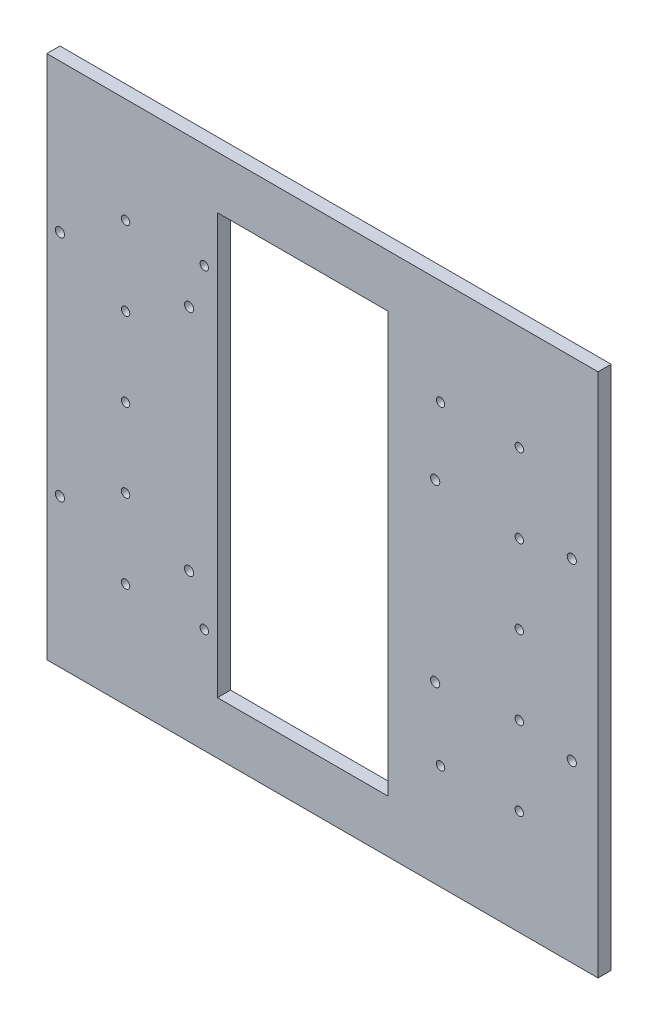
ISO-10303-21;
HEADER;
FILE_DESCRIPTION(('STEP AP214'),'2;1');
FILE_NAME('part.step','',(''),(''),'','','');
FILE_SCHEMA(('AUTOMOTIVE_DESIGN { 1 0 10303 214 1 1 1 1 }'));
ENDSEC;
DATA;
#1=APPLICATION_CONTEXT('core data for automotive mechanical design processes');
#2=APPLICATION_PROTOCOL_DEFINITION('international standard','automotive_design',2000,#1);
#3=PRODUCT_CONTEXT('',#1,'mechanical');
#4=PRODUCT('Part','Part','',(#3));
#5=PRODUCT_RELATED_PRODUCT_CATEGORY('part','',(#4));
#6=PRODUCT_DEFINITION_FORMATION('','',#4);
#7=PRODUCT_DEFINITION_CONTEXT('part definition',#1,'design');
#8=PRODUCT_DEFINITION('design','',#6,#7);
#9=PRODUCT_DEFINITION_SHAPE('','',#8);
#10=(LENGTH_UNIT() NAMED_UNIT(*) SI_UNIT(.MILLI.,.METRE.));
#11=(NAMED_UNIT(*) PLANE_ANGLE_UNIT() SI_UNIT($,.RADIAN.));
#12=(NAMED_UNIT(*) SI_UNIT($,.STERADIAN.) SOLID_ANGLE_UNIT());
#13=UNCERTAINTY_MEASURE_WITH_UNIT(LENGTH_MEASURE(1.E-05),#10,'distance_accuracy_value','');
#14=(GEOMETRIC_REPRESENTATION_CONTEXT(3) GLOBAL_UNCERTAINTY_ASSIGNED_CONTEXT((#13)) GLOBAL_UNIT_ASSIGNED_CONTEXT((#10,
#11,#12)) REPRESENTATION_CONTEXT('',''));
#15=CARTESIAN_POINT('',(0.,0.,0.));
#16=DIRECTION('',(0.,0.,1.));
#17=DIRECTION('',(1.,0.,0.));
#18=AXIS2_PLACEMENT_3D('',#15,#16,#17);
#19=CARTESIAN_POINT('',(0.,0.,5.));
#20=DIRECTION('',(0.,0.,1.));
#21=DIRECTION('',(1.,0.,0.));
#22=AXIS2_PLACEMENT_3D('',#19,#20,#21);
#23=PLANE('',#22);
#24=CARTESIAN_POINT('',(95.050009971844,33.7791498434514,5.));
#25=DIRECTION('',(0.,0.,1.));
#26=DIRECTION('',(1.,0.,0.));
#27=AXIS2_PLACEMENT_3D('',#24,#25,#26);
#28=CIRCLE('',#27,1.75);
#29=CARTESIAN_POINT('',(96.800009971844,33.7791498434514,5.));
#30=VERTEX_POINT('',#29);
#31=EDGE_CURVE('E855',#30,#30,#28,.T.);
#32=ORIENTED_EDGE('',*,*,#31,.F.);
#33=EDGE_LOOP('',(#32));
#34=FACE_BOUND('',#33,.T.);
#35=CARTESIAN_POINT('',(95.050009971844,-32.9208501565486,5.));
#36=DIRECTION('',(0.,0.,1.));
#37=DIRECTION('',(1.,0.,0.));
#38=AXIS2_PLACEMENT_3D('',#35,#36,#37);
#39=CIRCLE('',#38,1.75);
#40=CARTESIAN_POINT('',(96.800009971844,-32.9208501565486,5.));
#41=VERTEX_POINT('',#40);
#42=EDGE_CURVE('E851',#41,#41,#39,.T.);
#43=ORIENTED_EDGE('',*,*,#42,.F.);
#44=EDGE_LOOP('',(#43));
#45=FACE_BOUND('',#44,.T.);
#46=CARTESIAN_POINT('',(43.000009971844,-32.9208501565486,5.));
#47=DIRECTION('',(0.,0.,1.));
#48=DIRECTION('',(1.,0.,0.));
#49=AXIS2_PLACEMENT_3D('',#46,#47,#48);
#50=CIRCLE('',#49,1.75);
#51=CARTESIAN_POINT('',(44.750009971844,-32.9208501565486,5.));
#52=VERTEX_POINT('',#51);
#53=EDGE_CURVE('E848',#52,#52,#50,.T.);
#54=ORIENTED_EDGE('',*,*,#53,.F.);
#55=EDGE_LOOP('',(#54));
#56=FACE_BOUND('',#55,.T.);
#57=CARTESIAN_POINT('',(43.000009971844,33.7791498434514,5.));
#58=DIRECTION('',(0.,0.,1.));
#59=DIRECTION('',(1.,0.,0.));
#60=AXIS2_PLACEMENT_3D('',#57,#58,#59);
#61=CIRCLE('',#60,1.75);
#62=CARTESIAN_POINT('',(44.750009971844,33.7791498434514,5.));
#63=VERTEX_POINT('',#62);
#64=EDGE_CURVE('E144',#63,#63,#61,.T.);
#65=ORIENTED_EDGE('',*,*,#64,.F.);
#66=EDGE_LOOP('',(#65));
#67=FACE_BOUND('',#66,.T.);
#68=CARTESIAN_POINT('',(-50.739990028156,43.9691498434514,5.));
#69=DIRECTION('',(0.,0.,1.));
#70=DIRECTION('',(1.,0.,0.));
#71=AXIS2_PLACEMENT_3D('',#68,#69,#70);
#72=CIRCLE('',#71,1.75);
#73=CARTESIAN_POINT('',(-48.989990028156,43.9691498434514,5.));
#74=VERTEX_POINT('',#73);
#75=EDGE_CURVE('E151',#74,#74,#72,.T.);
#76=ORIENTED_EDGE('',*,*,#75,.F.);
#77=EDGE_LOOP('',(#76));
#78=FACE_BOUND('',#77,.T.);
#79=CARTESIAN_POINT('',(-50.739990028156,-43.1108501565486,5.));
#80=DIRECTION('',(0.,0.,1.));
#81=DIRECTION('',(1.,0.,0.));
#82=AXIS2_PLACEMENT_3D('',#79,#80,#81);
#83=CIRCLE('',#82,1.75);
#84=CARTESIAN_POINT('',(-48.989990028156,-43.1108501565486,5.));
#85=VERTEX_POINT('',#84);
#86=EDGE_CURVE('E157',#85,#85,#83,.T.);
#87=ORIENTED_EDGE('',*,*,#86,.F.);
#88=EDGE_LOOP('',(#87));
#89=FACE_BOUND('',#88,.T.);
#90=CARTESIAN_POINT('',(-99.949990028156,-43.1108501565486,5.));
#91=DIRECTION('',(0.,0.,1.));
#92=DIRECTION('',(1.,0.,0.));
#93=AXIS2_PLACEMENT_3D('',#90,#91,#92);
#94=CIRCLE('',#93,1.75);
#95=CARTESIAN_POINT('',(-98.199990028156,-43.1108501565486,5.));
#96=VERTEX_POINT('',#95);
#97=EDGE_CURVE('E152',#96,#96,#94,.T.);
#98=ORIENTED_EDGE('',*,*,#97,.F.);
#99=EDGE_LOOP('',(#98));
#100=FACE_BOUND('',#99,.T.);
#101=CARTESIAN_POINT('',(-99.949990028156,43.9691498434514,5.));
#102=DIRECTION('',(0.,0.,1.));
#103=DIRECTION('',(1.,0.,0.));
#104=AXIS2_PLACEMENT_3D('',#101,#102,#103);
#105=CIRCLE('',#104,1.75);
#106=CARTESIAN_POINT('',(-98.199990028156,43.9691498434514,5.));
#107=VERTEX_POINT('',#106);
#108=EDGE_CURVE('E156',#107,#107,#105,.T.);
#109=ORIENTED_EDGE('',*,*,#108,.F.);
#110=EDGE_LOOP('',(#109));
#111=FACE_BOUND('',#110,.T.);
#112=CARTESIAN_POINT('',(45.050009971844,60.4291498434514,5.));
#113=DIRECTION('',(0.,0.,1.));
#114=DIRECTION('',(1.,0.,0.));
#115=AXIS2_PLACEMENT_3D('',#112,#113,#114);
#116=CIRCLE('',#115,1.59999999999999);
#117=CARTESIAN_POINT('',(46.650009971844,60.4291498434514,5.));
#118=VERTEX_POINT('',#117);
#119=EDGE_CURVE('E191',#118,#118,#116,.T.);
#120=ORIENTED_EDGE('',*,*,#119,.F.);
#121=EDGE_LOOP('',(#120));
#122=FACE_BOUND('',#121,.T.);
#123=CARTESIAN_POINT('',(75.050009971844,-29.5708501565486,5.));
#124=DIRECTION('',(0.,0.,1.));
#125=DIRECTION('',(1.,0.,0.));
#126=AXIS2_PLACEMENT_3D('',#123,#124,#125);
#127=CIRCLE('',#126,1.59999999999999);
#128=CARTESIAN_POINT('',(76.650009971844,-29.5708501565486,5.));
#129=VERTEX_POINT('',#128);
#130=EDGE_CURVE('E207',#129,#129,#127,.T.);
#131=ORIENTED_EDGE('',*,*,#130,.F.);
#132=EDGE_LOOP('',(#131));
#133=FACE_BOUND('',#132,.T.);
#134=CARTESIAN_POINT('',(75.050009971844,0.42914984345141,5.));
#135=DIRECTION('',(0.,0.,1.));
#136=DIRECTION('',(1.,0.,0.));
#137=AXIS2_PLACEMENT_3D('',#134,#135,#136);
#138=CIRCLE('',#137,1.59999999999999);
#139=CARTESIAN_POINT('',(76.650009971844,0.42914984345141,5.));
#140=VERTEX_POINT('',#139);
#141=EDGE_CURVE('E223',#140,#140,#138,.T.);
#142=ORIENTED_EDGE('',*,*,#141,.F.);
#143=EDGE_LOOP('',(#142));
#144=FACE_BOUND('',#143,.T.);
#145=CARTESIAN_POINT('',(45.050009971844,-59.5708501565486,5.));
#146=DIRECTION('',(0.,0.,1.));
#147=DIRECTION('',(1.,0.,0.));
#148=AXIS2_PLACEMENT_3D('',#145,#146,#147);
#149=CIRCLE('',#148,1.59999999999999);
#150=CARTESIAN_POINT('',(46.650009971844,-59.5708501565486,5.));
#151=VERTEX_POINT('',#150);
#152=EDGE_CURVE('E239',#151,#151,#149,.T.);
#153=ORIENTED_EDGE('',*,*,#152,.F.);
#154=EDGE_LOOP('',(#153));
#155=FACE_BOUND('',#154,.T.);
#156=CARTESIAN_POINT('',(75.050009971844,30.4291498434514,5.));
#157=DIRECTION('',(0.,0.,1.));
#158=DIRECTION('',(1.,0.,0.));
#159=AXIS2_PLACEMENT_3D('',#156,#157,#158);
#160=CIRCLE('',#159,1.59999999999999);
#161=CARTESIAN_POINT('',(76.650009971844,30.4291498434514,5.));
#162=VERTEX_POINT('',#161);
#163=EDGE_CURVE('E255',#162,#162,#160,.T.);
#164=ORIENTED_EDGE('',*,*,#163,.F.);
#165=EDGE_LOOP('',(#164));
#166=FACE_BOUND('',#165,.T.);
#167=CARTESIAN_POINT('',(75.050009971844,-59.5708501565486,5.));
#168=DIRECTION('',(0.,0.,1.));
#169=DIRECTION('',(1.,0.,0.));
#170=AXIS2_PLACEMENT_3D('',#167,#168,#169);
#171=CIRCLE('',#170,1.59999999999999);
#172=CARTESIAN_POINT('',(76.650009971844,-59.5708501565486,5.));
#173=VERTEX_POINT('',#172);
#174=EDGE_CURVE('E271',#173,#173,#171,.T.);
#175=ORIENTED_EDGE('',*,*,#174,.F.);
#176=EDGE_LOOP('',(#175));
#177=FACE_BOUND('',#176,.T.);
#178=CARTESIAN_POINT('',(-74.949990028156,60.4291498434514,5.));
#179=DIRECTION('',(0.,0.,1.));
#180=DIRECTION('',(1.,0.,0.));
#181=AXIS2_PLACEMENT_3D('',#178,#179,#180);
#182=CIRCLE('',#181,1.6);
#183=CARTESIAN_POINT('',(-73.349990028156,60.4291498434514,5.));
#184=VERTEX_POINT('',#183);
#185=EDGE_CURVE('E287',#184,#184,#182,.T.);
#186=ORIENTED_EDGE('',*,*,#185,.F.);
#187=EDGE_LOOP('',(#186));
#188=FACE_BOUND('',#187,.T.);
#189=DIRECTION('',(-1.,0.,0.));
#190=VECTOR('',#189,1.);
#191=CARTESIAN_POINT('',(85.050009971844,100.429149843451,5.));
#192=LINE('',#191,#190);
#193=CARTESIAN_POINT('',(105.050009971844,100.429149843451,5.));
#194=VERTEX_POINT('',#193);
#195=CARTESIAN_POINT('',(-104.949990028156,100.429149843451,5.));
#196=VERTEX_POINT('',#195);
#197=EDGE_CURVE('E52',#194,#196,#192,.T.);
#198=ORIENTED_EDGE('',*,*,#197,.T.);
#199=DIRECTION('',(0.,1.,0.));
#200=VECTOR('',#199,1.);
#201=CARTESIAN_POINT('',(-104.949990028156,-99.5708501565486,5.));
#202=LINE('',#201,#200);
#203=CARTESIAN_POINT('',(-104.949990028156,-99.5708501565486,5.));
#204=VERTEX_POINT('',#203);
#205=EDGE_CURVE('E178',#204,#196,#202,.T.);
#206=ORIENTED_EDGE('',*,*,#205,.F.);
#207=DIRECTION('',(1.,0.,0.));
#208=VECTOR('',#207,1.);
#209=CARTESIAN_POINT('',(-84.949990028156,-99.5708501565486,5.));
#210=LINE('',#209,#208);
#211=CARTESIAN_POINT('',(105.050009971844,-99.5708501565486,5.));
#212=VERTEX_POINT('',#211);
#213=EDGE_CURVE('E11',#204,#212,#210,.T.);
#214=ORIENTED_EDGE('',*,*,#213,.T.);
#215=DIRECTION('',(0.,-1.,0.));
#216=VECTOR('',#215,1.);
#217=CARTESIAN_POINT('',(105.050009971844,100.429149843451,5.));
#218=LINE('',#217,#216);
#219=EDGE_CURVE('E137',#194,#212,#218,.T.);
#220=ORIENTED_EDGE('',*,*,#219,.F.);
#221=EDGE_LOOP('',(#198,#206,#214,#220));
#222=FACE_BOUND('',#221,.T.);
#223=DIRECTION('',(0.,-1.,0.));
#224=VECTOR('',#223,1.);
#225=CARTESIAN_POINT('',(-39.949990028156,80.4291498434514,5.));
#226=LINE('',#225,#224);
#227=CARTESIAN_POINT('',(-39.949990028156,80.4291498434514,5.));
#228=VERTEX_POINT('',#227);
#229=CARTESIAN_POINT('',(-39.949990028156,-79.5708501565486,5.));
#230=VERTEX_POINT('',#229);
#231=EDGE_CURVE('E297',#228,#230,#226,.T.);
#232=ORIENTED_EDGE('',*,*,#231,.F.);
#233=DIRECTION('',(-1.,0.,0.));
#234=VECTOR('',#233,1.);
#235=CARTESIAN_POINT('',(25.050009971844,80.4291498434514,5.));
#236=LINE('',#235,#234);
#237=CARTESIAN_POINT('',(25.050009971844,80.4291498434514,5.));
#238=VERTEX_POINT('',#237);
#239=EDGE_CURVE('E294',#238,#228,#236,.T.);
#240=ORIENTED_EDGE('',*,*,#239,.F.);
#241=DIRECTION('',(0.,1.,0.));
#242=VECTOR('',#241,1.);
#243=CARTESIAN_POINT('',(25.050009971844,-79.5708501565486,5.));
#244=LINE('',#243,#242);
#245=CARTESIAN_POINT('',(25.050009971844,-79.5708501565486,5.));
#246=VERTEX_POINT('',#245);
#247=EDGE_CURVE('E304',#246,#238,#244,.T.);
#248=ORIENTED_EDGE('',*,*,#247,.F.);
#249=DIRECTION('',(1.,0.,0.));
#250=VECTOR('',#249,1.);
#251=CARTESIAN_POINT('',(-39.949990028156,-79.5708501565486,5.));
#252=LINE('',#251,#250);
#253=EDGE_CURVE('E301',#230,#246,#252,.T.);
#254=ORIENTED_EDGE('',*,*,#253,.F.);
#255=EDGE_LOOP('',(#232,#240,#248,#254));
#256=FACE_BOUND('',#255,.T.);
#257=CARTESIAN_POINT('',(-74.949990028156,-59.5708501565486,5.));
#258=DIRECTION('',(0.,0.,1.));
#259=DIRECTION('',(1.,0.,0.));
#260=AXIS2_PLACEMENT_3D('',#257,#258,#259);
#261=CIRCLE('',#260,1.6);
#262=CARTESIAN_POINT('',(-73.349990028156,-59.5708501565486,5.));
#263=VERTEX_POINT('',#262);
#264=EDGE_CURVE('E279',#263,#263,#261,.T.);
#265=ORIENTED_EDGE('',*,*,#264,.F.);
#266=EDGE_LOOP('',(#265));
#267=FACE_BOUND('',#266,.T.);
#268=CARTESIAN_POINT('',(75.050009971844,60.4291498434514,5.));
#269=DIRECTION('',(0.,0.,1.));
#270=DIRECTION('',(1.,0.,0.));
#271=AXIS2_PLACEMENT_3D('',#268,#269,#270);
#272=CIRCLE('',#271,1.59999999999999);
#273=CARTESIAN_POINT('',(76.650009971844,60.4291498434514,5.));
#274=VERTEX_POINT('',#273);
#275=EDGE_CURVE('E263',#274,#274,#272,.T.);
#276=ORIENTED_EDGE('',*,*,#275,.F.);
#277=EDGE_LOOP('',(#276));
#278=FACE_BOUND('',#277,.T.);
#279=CARTESIAN_POINT('',(-74.949990028156,30.4291498434514,5.));
#280=DIRECTION('',(0.,0.,1.));
#281=DIRECTION('',(1.,0.,0.));
#282=AXIS2_PLACEMENT_3D('',#279,#280,#281);
#283=CIRCLE('',#282,1.60000000000001);
#284=CARTESIAN_POINT('',(-73.349990028156,30.4291498434514,5.));
#285=VERTEX_POINT('',#284);
#286=EDGE_CURVE('E247',#285,#285,#283,.T.);
#287=ORIENTED_EDGE('',*,*,#286,.F.);
#288=EDGE_LOOP('',(#287));
#289=FACE_BOUND('',#288,.T.);
#290=CARTESIAN_POINT('',(-74.949990028156,0.429149843451382,5.));
#291=DIRECTION('',(0.,0.,1.));
#292=DIRECTION('',(1.,0.,0.));
#293=AXIS2_PLACEMENT_3D('',#290,#291,#292);
#294=CIRCLE('',#293,1.60000000000001);
#295=CARTESIAN_POINT('',(-73.349990028156,0.429149843451382,5.));
#296=VERTEX_POINT('',#295);
#297=EDGE_CURVE('E231',#296,#296,#294,.T.);
#298=ORIENTED_EDGE('',*,*,#297,.F.);
#299=EDGE_LOOP('',(#298));
#300=FACE_BOUND('',#299,.T.);
#301=CARTESIAN_POINT('',(-74.949990028156,-29.5708501565486,5.));
#302=DIRECTION('',(0.,0.,1.));
#303=DIRECTION('',(1.,0.,0.));
#304=AXIS2_PLACEMENT_3D('',#301,#302,#303);
#305=CIRCLE('',#304,1.6);
#306=CARTESIAN_POINT('',(-73.349990028156,-29.5708501565486,5.));
#307=VERTEX_POINT('',#306);
#308=EDGE_CURVE('E215',#307,#307,#305,.T.);
#309=ORIENTED_EDGE('',*,*,#308,.F.);
#310=EDGE_LOOP('',(#309));
#311=FACE_BOUND('',#310,.T.);
#312=CARTESIAN_POINT('',(-44.949990028156,-59.5708501565486,5.));
#313=DIRECTION('',(0.,0.,1.));
#314=DIRECTION('',(1.,0.,0.));
#315=AXIS2_PLACEMENT_3D('',#312,#313,#314);
#316=CIRCLE('',#315,1.6);
#317=CARTESIAN_POINT('',(-43.349990028156,-59.5708501565486,5.));
#318=VERTEX_POINT('',#317);
#319=EDGE_CURVE('E199',#318,#318,#316,.T.);
#320=ORIENTED_EDGE('',*,*,#319,.F.);
#321=EDGE_LOOP('',(#320));
#322=FACE_BOUND('',#321,.T.);
#323=CARTESIAN_POINT('',(-44.949990028156,60.4291498434514,5.));
#324=DIRECTION('',(0.,0.,1.));
#325=DIRECTION('',(1.,0.,0.));
#326=AXIS2_PLACEMENT_3D('',#323,#324,#325);
#327=CIRCLE('',#326,1.6);
#328=CARTESIAN_POINT('',(-43.349990028156,60.4291498434514,5.));
#329=VERTEX_POINT('',#328);
#330=EDGE_CURVE('E183',#329,#329,#327,.T.);
#331=ORIENTED_EDGE('',*,*,#330,.F.);
#332=EDGE_LOOP('',(#331));
#333=FACE_BOUND('',#332,.T.);
#334=ADVANCED_FACE('F42',(#34,#45,#56,#67,#78,#89,#100,#111,#122,#133,#144,#155,#166,#177,#188,
#222,#256,#267,#278,#289,#300,#311,#322,#333),#23,.T.);
#335=CARTESIAN_POINT('',(0.,0.,0.));
#336=DIRECTION('',(0.,0.,1.));
#337=DIRECTION('',(1.,0.,0.));
#338=AXIS2_PLACEMENT_3D('',#335,#336,#337);
#339=PLANE('',#338);
#340=CARTESIAN_POINT('',(95.050009971844,33.7791498434514,0.));
#341=DIRECTION('',(0.,0.,1.));
#342=DIRECTION('',(1.,0.,0.));
#343=AXIS2_PLACEMENT_3D('',#340,#341,#342);
#344=CIRCLE('',#343,1.75);
#345=CARTESIAN_POINT('',(96.800009971844,33.7791498434514,0.));
#346=VERTEX_POINT('',#345);
#347=EDGE_CURVE('E46',#346,#346,#344,.T.);
#348=ORIENTED_EDGE('',*,*,#347,.T.);
#349=EDGE_LOOP('',(#348));
#350=FACE_BOUND('',#349,.T.);
#351=CARTESIAN_POINT('',(95.050009971844,-32.9208501565486,0.));
#352=DIRECTION('',(0.,0.,1.));
#353=DIRECTION('',(1.,0.,0.));
#354=AXIS2_PLACEMENT_3D('',#351,#352,#353);
#355=CIRCLE('',#354,1.75);
#356=CARTESIAN_POINT('',(96.800009971844,-32.9208501565486,0.));
#357=VERTEX_POINT('',#356);
#358=EDGE_CURVE('E142',#357,#357,#355,.T.);
#359=ORIENTED_EDGE('',*,*,#358,.T.);
#360=EDGE_LOOP('',(#359));
#361=FACE_BOUND('',#360,.T.);
#362=CARTESIAN_POINT('',(43.000009971844,-32.9208501565486,0.));
#363=DIRECTION('',(0.,0.,1.));
#364=DIRECTION('',(1.,0.,0.));
#365=AXIS2_PLACEMENT_3D('',#362,#363,#364);
#366=CIRCLE('',#365,1.75);
#367=CARTESIAN_POINT('',(44.750009971844,-32.9208501565486,0.));
#368=VERTEX_POINT('',#367);
#369=EDGE_CURVE('E353',#368,#368,#366,.T.);
#370=ORIENTED_EDGE('',*,*,#369,.T.);
#371=EDGE_LOOP('',(#370));
#372=FACE_BOUND('',#371,.T.);
#373=CARTESIAN_POINT('',(43.000009971844,33.7791498434514,0.));
#374=DIRECTION('',(0.,0.,1.));
#375=DIRECTION('',(1.,0.,0.));
#376=AXIS2_PLACEMENT_3D('',#373,#374,#375);
#377=CIRCLE('',#376,1.75);
#378=CARTESIAN_POINT('',(44.750009971844,33.7791498434514,0.));
#379=VERTEX_POINT('',#378);
#380=EDGE_CURVE('E349',#379,#379,#377,.T.);
#381=ORIENTED_EDGE('',*,*,#380,.T.);
#382=EDGE_LOOP('',(#381));
#383=FACE_BOUND('',#382,.T.);
#384=CARTESIAN_POINT('',(-50.739990028156,43.9691498434514,0.));
#385=DIRECTION('',(0.,0.,1.));
#386=DIRECTION('',(1.,0.,0.));
#387=AXIS2_PLACEMENT_3D('',#384,#385,#386);
#388=CIRCLE('',#387,1.75);
#389=CARTESIAN_POINT('',(-48.989990028156,43.9691498434514,0.));
#390=VERTEX_POINT('',#389);
#391=EDGE_CURVE('E173',#390,#390,#388,.T.);
#392=ORIENTED_EDGE('',*,*,#391,.T.);
#393=EDGE_LOOP('',(#392));
#394=FACE_BOUND('',#393,.T.);
#395=CARTESIAN_POINT('',(-50.739990028156,-43.1108501565486,0.));
#396=DIRECTION('',(0.,0.,1.));
#397=DIRECTION('',(1.,0.,0.));
#398=AXIS2_PLACEMENT_3D('',#395,#396,#397);
#399=CIRCLE('',#398,1.75);
#400=CARTESIAN_POINT('',(-48.989990028156,-43.1108501565486,0.));
#401=VERTEX_POINT('',#400);
#402=EDGE_CURVE('E342',#401,#401,#399,.T.);
#403=ORIENTED_EDGE('',*,*,#402,.T.);
#404=EDGE_LOOP('',(#403));
#405=FACE_BOUND('',#404,.T.);
#406=CARTESIAN_POINT('',(-99.949990028156,-43.1108501565486,0.));
#407=DIRECTION('',(0.,0.,1.));
#408=DIRECTION('',(1.,0.,0.));
#409=AXIS2_PLACEMENT_3D('',#406,#407,#408);
#410=CIRCLE('',#409,1.75);
#411=CARTESIAN_POINT('',(-98.199990028156,-43.1108501565486,0.));
#412=VERTEX_POINT('',#411);
#413=EDGE_CURVE('E338',#412,#412,#410,.T.);
#414=ORIENTED_EDGE('',*,*,#413,.T.);
#415=EDGE_LOOP('',(#414));
#416=FACE_BOUND('',#415,.T.);
#417=CARTESIAN_POINT('',(-99.949990028156,43.9691498434514,0.));
#418=DIRECTION('',(0.,0.,1.));
#419=DIRECTION('',(1.,0.,0.));
#420=AXIS2_PLACEMENT_3D('',#417,#418,#419);
#421=CIRCLE('',#420,1.75);
#422=CARTESIAN_POINT('',(-98.199990028156,43.9691498434514,0.));
#423=VERTEX_POINT('',#422);
#424=EDGE_CURVE('E167',#423,#423,#421,.T.);
#425=ORIENTED_EDGE('',*,*,#424,.T.);
#426=EDGE_LOOP('',(#425));
#427=FACE_BOUND('',#426,.T.);
#428=DIRECTION('',(-1.,0.,0.));
#429=VECTOR('',#428,1.);
#430=CARTESIAN_POINT('',(85.050009971844,100.429149843451,0.));
#431=LINE('',#430,#429);
#432=CARTESIAN_POINT('',(105.050009971844,100.429149843451,0.));
#433=VERTEX_POINT('',#432);
#434=CARTESIAN_POINT('',(-104.949990028156,100.429149843451,0.));
#435=VERTEX_POINT('',#434);
#436=EDGE_CURVE('E122',#433,#435,#431,.T.);
#437=ORIENTED_EDGE('',*,*,#436,.F.);
#438=DIRECTION('',(0.,1.,0.));
#439=VECTOR('',#438,1.);
#440=CARTESIAN_POINT('',(105.050009971844,-99.5708501565486,0.));
#441=LINE('',#440,#439);
#442=CARTESIAN_POINT('',(105.050009971844,-99.5708501565486,0.));
#443=VERTEX_POINT('',#442);
#444=EDGE_CURVE('E125',#443,#433,#441,.T.);
#445=ORIENTED_EDGE('',*,*,#444,.F.);
#446=DIRECTION('',(1.,0.,0.));
#447=VECTOR('',#446,1.);
#448=CARTESIAN_POINT('',(-84.949990028156,-99.5708501565486,0.));
#449=LINE('',#448,#447);
#450=CARTESIAN_POINT('',(-104.949990028156,-99.5708501565486,0.));
#451=VERTEX_POINT('',#450);
#452=EDGE_CURVE('E111',#451,#443,#449,.T.);
#453=ORIENTED_EDGE('',*,*,#452,.F.);
#454=DIRECTION('',(0.,-1.,0.));
#455=VECTOR('',#454,1.);
#456=CARTESIAN_POINT('',(-104.949990028156,100.429149843451,0.));
#457=LINE('',#456,#455);
#458=EDGE_CURVE('E172',#435,#451,#457,.T.);
#459=ORIENTED_EDGE('',*,*,#458,.F.);
#460=EDGE_LOOP('',(#437,#445,#453,#459));
#461=FACE_BOUND('',#460,.T.);
#462=DIRECTION('',(-1.,0.,0.));
#463=VECTOR('',#462,1.);
#464=CARTESIAN_POINT('',(25.050009971844,80.4291498434514,0.));
#465=LINE('',#464,#463);
#466=CARTESIAN_POINT('',(25.050009971844,80.4291498434514,0.));
#467=VERTEX_POINT('',#466);
#468=CARTESIAN_POINT('',(-39.949990028156,80.4291498434514,0.));
#469=VERTEX_POINT('',#468);
#470=EDGE_CURVE('E68',#467,#469,#465,.T.);
#471=ORIENTED_EDGE('',*,*,#470,.T.);
#472=DIRECTION('',(0.,-1.,0.));
#473=VECTOR('',#472,1.);
#474=CARTESIAN_POINT('',(-39.949990028156,80.4291498434514,0.));
#475=LINE('',#474,#473);
#476=CARTESIAN_POINT('',(-39.949990028156,-79.5708501565486,0.));
#477=VERTEX_POINT('',#476);
#478=EDGE_CURVE('E310',#469,#477,#475,.T.);
#479=ORIENTED_EDGE('',*,*,#478,.T.);
#480=DIRECTION('',(1.,0.,0.));
#481=VECTOR('',#480,1.);
#482=CARTESIAN_POINT('',(-39.949990028156,-79.5708501565486,0.));
#483=LINE('',#482,#481);
#484=CARTESIAN_POINT('',(25.050009971844,-79.5708501565486,0.));
#485=VERTEX_POINT('',#484);
#486=EDGE_CURVE('E314',#477,#485,#483,.T.);
#487=ORIENTED_EDGE('',*,*,#486,.T.);
#488=DIRECTION('',(0.,1.,0.));
#489=VECTOR('',#488,1.);
#490=CARTESIAN_POINT('',(25.050009971844,-79.5708501565486,0.));
#491=LINE('',#490,#489);
#492=EDGE_CURVE('E298',#485,#467,#491,.T.);
#493=ORIENTED_EDGE('',*,*,#492,.T.);
#494=EDGE_LOOP('',(#471,#479,#487,#493));
#495=FACE_BOUND('',#494,.T.);
#496=CARTESIAN_POINT('',(-74.949990028156,60.4291498434514,0.));
#497=DIRECTION('',(0.,0.,1.));
#498=DIRECTION('',(1.,0.,0.));
#499=AXIS2_PLACEMENT_3D('',#496,#497,#498);
#500=CIRCLE('',#499,1.6);
#501=CARTESIAN_POINT('',(-73.349990028156,60.4291498434514,0.));
#502=VERTEX_POINT('',#501);
#503=EDGE_CURVE('E283',#502,#502,#500,.T.);
#504=ORIENTED_EDGE('',*,*,#503,.T.);
#505=EDGE_LOOP('',(#504));
#506=FACE_BOUND('',#505,.T.);
#507=CARTESIAN_POINT('',(-74.949990028156,-59.5708501565486,0.));
#508=DIRECTION('',(0.,0.,1.));
#509=DIRECTION('',(1.,0.,0.));
#510=AXIS2_PLACEMENT_3D('',#507,#508,#509);
#511=CIRCLE('',#510,1.6);
#512=CARTESIAN_POINT('',(-73.349990028156,-59.5708501565486,0.));
#513=VERTEX_POINT('',#512);
#514=EDGE_CURVE('E275',#513,#513,#511,.T.);
#515=ORIENTED_EDGE('',*,*,#514,.T.);
#516=EDGE_LOOP('',(#515));
#517=FACE_BOUND('',#516,.T.);
#518=CARTESIAN_POINT('',(75.050009971844,-59.5708501565486,0.));
#519=DIRECTION('',(0.,0.,1.));
#520=DIRECTION('',(1.,0.,0.));
#521=AXIS2_PLACEMENT_3D('',#518,#519,#520);
#522=CIRCLE('',#521,1.59999999999999);
#523=CARTESIAN_POINT('',(76.650009971844,-59.5708501565486,0.));
#524=VERTEX_POINT('',#523);
#525=EDGE_CURVE('E267',#524,#524,#522,.T.);
#526=ORIENTED_EDGE('',*,*,#525,.T.);
#527=EDGE_LOOP('',(#526));
#528=FACE_BOUND('',#527,.T.);
#529=CARTESIAN_POINT('',(75.050009971844,60.4291498434514,0.));
#530=DIRECTION('',(0.,0.,1.));
#531=DIRECTION('',(1.,0.,0.));
#532=AXIS2_PLACEMENT_3D('',#529,#530,#531);
#533=CIRCLE('',#532,1.59999999999999);
#534=CARTESIAN_POINT('',(76.650009971844,60.4291498434514,0.));
#535=VERTEX_POINT('',#534);
#536=EDGE_CURVE('E259',#535,#535,#533,.T.);
#537=ORIENTED_EDGE('',*,*,#536,.T.);
#538=EDGE_LOOP('',(#537));
#539=FACE_BOUND('',#538,.T.);
#540=CARTESIAN_POINT('',(75.050009971844,30.4291498434514,0.));
#541=DIRECTION('',(0.,0.,1.));
#542=DIRECTION('',(1.,0.,0.));
#543=AXIS2_PLACEMENT_3D('',#540,#541,#542);
#544=CIRCLE('',#543,1.59999999999999);
#545=CARTESIAN_POINT('',(76.650009971844,30.4291498434514,0.));
#546=VERTEX_POINT('',#545);
#547=EDGE_CURVE('E251',#546,#546,#544,.T.);
#548=ORIENTED_EDGE('',*,*,#547,.T.);
#549=EDGE_LOOP('',(#548));
#550=FACE_BOUND('',#549,.T.);
#551=CARTESIAN_POINT('',(-74.949990028156,30.4291498434514,0.));
#552=DIRECTION('',(0.,0.,1.));
#553=DIRECTION('',(1.,0.,0.));
#554=AXIS2_PLACEMENT_3D('',#551,#552,#553);
#555=CIRCLE('',#554,1.60000000000001);
#556=CARTESIAN_POINT('',(-73.349990028156,30.4291498434514,0.));
#557=VERTEX_POINT('',#556);
#558=EDGE_CURVE('E243',#557,#557,#555,.T.);
#559=ORIENTED_EDGE('',*,*,#558,.T.);
#560=EDGE_LOOP('',(#559));
#561=FACE_BOUND('',#560,.T.);
#562=CARTESIAN_POINT('',(45.050009971844,-59.5708501565486,0.));
#563=DIRECTION('',(0.,0.,1.));
#564=DIRECTION('',(1.,0.,0.));
#565=AXIS2_PLACEMENT_3D('',#562,#563,#564);
#566=CIRCLE('',#565,1.59999999999999);
#567=CARTESIAN_POINT('',(46.650009971844,-59.5708501565486,0.));
#568=VERTEX_POINT('',#567);
#569=EDGE_CURVE('E235',#568,#568,#566,.T.);
#570=ORIENTED_EDGE('',*,*,#569,.T.);
#571=EDGE_LOOP('',(#570));
#572=FACE_BOUND('',#571,.T.);
#573=CARTESIAN_POINT('',(-74.949990028156,0.429149843451382,0.));
#574=DIRECTION('',(0.,0.,1.));
#575=DIRECTION('',(1.,0.,0.));
#576=AXIS2_PLACEMENT_3D('',#573,#574,#575);
#577=CIRCLE('',#576,1.60000000000001);
#578=CARTESIAN_POINT('',(-73.349990028156,0.429149843451382,0.));
#579=VERTEX_POINT('',#578);
#580=EDGE_CURVE('E227',#579,#579,#577,.T.);
#581=ORIENTED_EDGE('',*,*,#580,.T.);
#582=EDGE_LOOP('',(#581));
#583=FACE_BOUND('',#582,.T.);
#584=CARTESIAN_POINT('',(75.050009971844,0.42914984345141,0.));
#585=DIRECTION('',(0.,0.,1.));
#586=DIRECTION('',(1.,0.,0.));
#587=AXIS2_PLACEMENT_3D('',#584,#585,#586);
#588=CIRCLE('',#587,1.59999999999999);
#589=CARTESIAN_POINT('',(76.650009971844,0.42914984345141,0.));
#590=VERTEX_POINT('',#589);
#591=EDGE_CURVE('E219',#590,#590,#588,.T.);
#592=ORIENTED_EDGE('',*,*,#591,.T.);
#593=EDGE_LOOP('',(#592));
#594=FACE_BOUND('',#593,.T.);
#595=CARTESIAN_POINT('',(-74.949990028156,-29.5708501565486,0.));
#596=DIRECTION('',(0.,0.,1.));
#597=DIRECTION('',(1.,0.,0.));
#598=AXIS2_PLACEMENT_3D('',#595,#596,#597);
#599=CIRCLE('',#598,1.6);
#600=CARTESIAN_POINT('',(-73.349990028156,-29.5708501565486,0.));
#601=VERTEX_POINT('',#600);
#602=EDGE_CURVE('E211',#601,#601,#599,.T.);
#603=ORIENTED_EDGE('',*,*,#602,.T.);
#604=EDGE_LOOP('',(#603));
#605=FACE_BOUND('',#604,.T.);
#606=CARTESIAN_POINT('',(75.050009971844,-29.5708501565486,0.));
#607=DIRECTION('',(0.,0.,1.));
#608=DIRECTION('',(1.,0.,0.));
#609=AXIS2_PLACEMENT_3D('',#606,#607,#608);
#610=CIRCLE('',#609,1.59999999999999);
#611=CARTESIAN_POINT('',(76.650009971844,-29.5708501565486,0.));
#612=VERTEX_POINT('',#611);
#613=EDGE_CURVE('E203',#612,#612,#610,.T.);
#614=ORIENTED_EDGE('',*,*,#613,.T.);
#615=EDGE_LOOP('',(#614));
#616=FACE_BOUND('',#615,.T.);
#617=CARTESIAN_POINT('',(-44.949990028156,-59.5708501565486,0.));
#618=DIRECTION('',(0.,0.,1.));
#619=DIRECTION('',(1.,0.,0.));
#620=AXIS2_PLACEMENT_3D('',#617,#618,#619);
#621=CIRCLE('',#620,1.6);
#622=CARTESIAN_POINT('',(-43.349990028156,-59.5708501565486,0.));
#623=VERTEX_POINT('',#622);
#624=EDGE_CURVE('E195',#623,#623,#621,.T.);
#625=ORIENTED_EDGE('',*,*,#624,.T.);
#626=EDGE_LOOP('',(#625));
#627=FACE_BOUND('',#626,.T.);
#628=CARTESIAN_POINT('',(45.050009971844,60.4291498434514,0.));
#629=DIRECTION('',(0.,0.,1.));
#630=DIRECTION('',(1.,0.,0.));
#631=AXIS2_PLACEMENT_3D('',#628,#629,#630);
#632=CIRCLE('',#631,1.59999999999999);
#633=CARTESIAN_POINT('',(46.650009971844,60.4291498434514,0.));
#634=VERTEX_POINT('',#633);
#635=EDGE_CURVE('E187',#634,#634,#632,.T.);
#636=ORIENTED_EDGE('',*,*,#635,.T.);
#637=EDGE_LOOP('',(#636));
#638=FACE_BOUND('',#637,.T.);
#639=CARTESIAN_POINT('',(-44.949990028156,60.4291498434514,0.));
#640=DIRECTION('',(0.,0.,1.));
#641=DIRECTION('',(1.,0.,0.));
#642=AXIS2_PLACEMENT_3D('',#639,#640,#641);
#643=CIRCLE('',#642,1.6);
#644=CARTESIAN_POINT('',(-43.349990028156,60.4291498434514,0.));
#645=VERTEX_POINT('',#644);
#646=EDGE_CURVE('E182',#645,#645,#643,.T.);
#647=ORIENTED_EDGE('',*,*,#646,.T.);
#648=EDGE_LOOP('',(#647));
#649=FACE_BOUND('',#648,.T.);
#650=ADVANCED_FACE('F126',(#350,#361,#372,#383,#394,#405,#416,#427,#461,#495,#506,#517,#528,
#539,#550,#561,#572,#583,#594,#605,#616,#627,#638,#649),#339,.F.);
#651=CARTESIAN_POINT('',(85.050009971844,100.429149843451,5.));
#652=DIRECTION('',(0.,-1.,0.));
#653=DIRECTION('',(0.,0.,-1.));
#654=AXIS2_PLACEMENT_3D('',#651,#652,#653);
#655=PLANE('',#654);
#656=ORIENTED_EDGE('',*,*,#436,.T.);
#657=DIRECTION('',(0.,0.,-1.));
#658=VECTOR('',#657,1.);
#659=CARTESIAN_POINT('',(-104.949990028156,100.429149843451,5.));
#660=LINE('',#659,#658);
#661=EDGE_CURVE('E168',#196,#435,#660,.T.);
#662=ORIENTED_EDGE('',*,*,#661,.F.);
#663=ORIENTED_EDGE('',*,*,#197,.F.);
#664=DIRECTION('',(0.,0.,1.));
#665=VECTOR('',#664,1.);
#666=CARTESIAN_POINT('',(105.050009971844,100.429149843451,0.));
#667=LINE('',#666,#665);
#668=EDGE_CURVE('E132',#433,#194,#667,.T.);
#669=ORIENTED_EDGE('',*,*,#668,.F.);
#670=EDGE_LOOP('',(#656,#662,#663,#669));
#671=FACE_BOUND('',#670,.T.);
#672=ADVANCED_FACE('F44',(#671),#655,.F.);
#673=CARTESIAN_POINT('',(-84.949990028156,-99.5708501565486,5.));
#674=DIRECTION('',(0.,1.,0.));
#675=DIRECTION('',(0.,0.,1.));
#676=AXIS2_PLACEMENT_3D('',#673,#674,#675);
#677=PLANE('',#676);
#678=ORIENTED_EDGE('',*,*,#452,.T.);
#679=DIRECTION('',(0.,0.,-1.));
#680=VECTOR('',#679,1.);
#681=CARTESIAN_POINT('',(105.050009971844,-99.5708501565486,5.));
#682=LINE('',#681,#680);
#683=EDGE_CURVE('E115',#212,#443,#682,.T.);
#684=ORIENTED_EDGE('',*,*,#683,.F.);
#685=ORIENTED_EDGE('',*,*,#213,.F.);
#686=DIRECTION('',(0.,0.,1.));
#687=VECTOR('',#686,1.);
#688=CARTESIAN_POINT('',(-104.949990028156,-99.5708501565486,0.));
#689=LINE('',#688,#687);
#690=EDGE_CURVE('E117',#451,#204,#689,.T.);
#691=ORIENTED_EDGE('',*,*,#690,.F.);
#692=EDGE_LOOP('',(#678,#684,#685,#691));
#693=FACE_BOUND('',#692,.T.);
#694=ADVANCED_FACE('F113',(#693),#677,.F.);
#695=CARTESIAN_POINT('',(25.050009971844,80.4291498434514,5.));
#696=DIRECTION('',(0.,-1.,0.));
#697=DIRECTION('',(0.,0.,-1.));
#698=AXIS2_PLACEMENT_3D('',#695,#696,#697);
#699=PLANE('',#698);
#700=ORIENTED_EDGE('',*,*,#470,.F.);
#701=DIRECTION('',(0.,0.,-1.));
#702=VECTOR('',#701,1.);
#703=CARTESIAN_POINT('',(25.050009971844,80.4291498434514,5.));
#704=LINE('',#703,#702);
#705=EDGE_CURVE('E307',#238,#467,#704,.T.);
#706=ORIENTED_EDGE('',*,*,#705,.F.);
#707=ORIENTED_EDGE('',*,*,#239,.T.);
#708=DIRECTION('',(0.,0.,-1.));
#709=VECTOR('',#708,1.);
#710=CARTESIAN_POINT('',(-39.949990028156,80.4291498434514,5.));
#711=LINE('',#710,#709);
#712=EDGE_CURVE('E328',#228,#469,#711,.T.);
#713=ORIENTED_EDGE('',*,*,#712,.T.);
#714=EDGE_LOOP('',(#700,#706,#707,#713));
#715=FACE_BOUND('',#714,.T.);
#716=ADVANCED_FACE('F389',(#715),#699,.T.);
#717=CARTESIAN_POINT('',(-39.949990028156,80.4291498434514,5.));
#718=DIRECTION('',(1.,0.,0.));
#719=DIRECTION('',(0.,1.,0.));
#720=AXIS2_PLACEMENT_3D('',#717,#718,#719);
#721=PLANE('',#720);
#722=ORIENTED_EDGE('',*,*,#478,.F.);
#723=ORIENTED_EDGE('',*,*,#712,.F.);
#724=ORIENTED_EDGE('',*,*,#231,.T.);
#725=DIRECTION('',(0.,0.,-1.));
#726=VECTOR('',#725,1.);
#727=CARTESIAN_POINT('',(-39.949990028156,-79.5708501565486,5.));
#728=LINE('',#727,#726);
#729=EDGE_CURVE('E325',#230,#477,#728,.T.);
#730=ORIENTED_EDGE('',*,*,#729,.T.);
#731=EDGE_LOOP('',(#722,#723,#724,#730));
#732=FACE_BOUND('',#731,.T.);
#733=ADVANCED_FACE('F396',(#732),#721,.T.);
#734=CARTESIAN_POINT('',(-39.949990028156,-79.5708501565486,5.));
#735=DIRECTION('',(0.,1.,0.));
#736=DIRECTION('',(0.,0.,1.));
#737=AXIS2_PLACEMENT_3D('',#734,#735,#736);
#738=PLANE('',#737);
#739=ORIENTED_EDGE('',*,*,#486,.F.);
#740=ORIENTED_EDGE('',*,*,#729,.F.);
#741=ORIENTED_EDGE('',*,*,#253,.T.);
#742=DIRECTION('',(0.,0.,-1.));
#743=VECTOR('',#742,1.);
#744=CARTESIAN_POINT('',(25.050009971844,-79.5708501565486,5.));
#745=LINE('',#744,#743);
#746=EDGE_CURVE('E60',#246,#485,#745,.T.);
#747=ORIENTED_EDGE('',*,*,#746,.T.);
#748=EDGE_LOOP('',(#739,#740,#741,#747));
#749=FACE_BOUND('',#748,.T.);
#750=ADVANCED_FACE('F492',(#749),#738,.T.);
#751=CARTESIAN_POINT('',(25.050009971844,-79.5708501565486,5.));
#752=DIRECTION('',(-1.,0.,0.));
#753=DIRECTION('',(0.,0.,1.));
#754=AXIS2_PLACEMENT_3D('',#751,#752,#753);
#755=PLANE('',#754);
#756=ORIENTED_EDGE('',*,*,#492,.F.);
#757=ORIENTED_EDGE('',*,*,#746,.F.);
#758=ORIENTED_EDGE('',*,*,#247,.T.);
#759=ORIENTED_EDGE('',*,*,#705,.T.);
#760=EDGE_LOOP('',(#756,#757,#758,#759));
#761=FACE_BOUND('',#760,.T.);
#762=ADVANCED_FACE('F488',(#761),#755,.T.);
#763=CARTESIAN_POINT('',(-74.949990028156,60.4291498434514,5.));
#764=DIRECTION('',(0.,0.,-1.));
#765=DIRECTION('',(-1.,0.,0.));
#766=AXIS2_PLACEMENT_3D('',#763,#764,#765);
#767=CYLINDRICAL_SURFACE('',#766,1.6);
#768=ORIENTED_EDGE('',*,*,#185,.T.);
#769=EDGE_LOOP('',(#768));
#770=FACE_BOUND('',#769,.T.);
#771=ORIENTED_EDGE('',*,*,#503,.F.);
#772=EDGE_LOOP('',(#771));
#773=FACE_BOUND('',#772,.T.);
#774=ADVANCED_FACE('F484',(#770,#773),#767,.F.);
#775=CARTESIAN_POINT('',(-74.949990028156,-59.5708501565486,5.));
#776=DIRECTION('',(0.,0.,-1.));
#777=DIRECTION('',(-1.,0.,0.));
#778=AXIS2_PLACEMENT_3D('',#775,#776,#777);
#779=CYLINDRICAL_SURFACE('',#778,1.6);
#780=ORIENTED_EDGE('',*,*,#264,.T.);
#781=EDGE_LOOP('',(#780));
#782=FACE_BOUND('',#781,.T.);
#783=ORIENTED_EDGE('',*,*,#514,.F.);
#784=EDGE_LOOP('',(#783));
#785=FACE_BOUND('',#784,.T.);
#786=ADVANCED_FACE('F480',(#782,#785),#779,.F.);
#787=CARTESIAN_POINT('',(75.050009971844,-59.5708501565486,5.));
#788=DIRECTION('',(0.,0.,-1.));
#789=DIRECTION('',(-1.,0.,0.));
#790=AXIS2_PLACEMENT_3D('',#787,#788,#789);
#791=CYLINDRICAL_SURFACE('',#790,1.59999999999999);
#792=ORIENTED_EDGE('',*,*,#174,.T.);
#793=EDGE_LOOP('',(#792));
#794=FACE_BOUND('',#793,.T.);
#795=ORIENTED_EDGE('',*,*,#525,.F.);
#796=EDGE_LOOP('',(#795));
#797=FACE_BOUND('',#796,.T.);
#798=ADVANCED_FACE('F476',(#794,#797),#791,.F.);
#799=CARTESIAN_POINT('',(75.050009971844,60.4291498434514,5.));
#800=DIRECTION('',(0.,0.,-1.));
#801=DIRECTION('',(-1.,0.,0.));
#802=AXIS2_PLACEMENT_3D('',#799,#800,#801);
#803=CYLINDRICAL_SURFACE('',#802,1.59999999999999);
#804=ORIENTED_EDGE('',*,*,#275,.T.);
#805=EDGE_LOOP('',(#804));
#806=FACE_BOUND('',#805,.T.);
#807=ORIENTED_EDGE('',*,*,#536,.F.);
#808=EDGE_LOOP('',(#807));
#809=FACE_BOUND('',#808,.T.);
#810=ADVANCED_FACE('F472',(#806,#809),#803,.F.);
#811=CARTESIAN_POINT('',(75.050009971844,30.4291498434514,5.));
#812=DIRECTION('',(0.,0.,-1.));
#813=DIRECTION('',(-1.,0.,0.));
#814=AXIS2_PLACEMENT_3D('',#811,#812,#813);
#815=CYLINDRICAL_SURFACE('',#814,1.59999999999999);
#816=ORIENTED_EDGE('',*,*,#163,.T.);
#817=EDGE_LOOP('',(#816));
#818=FACE_BOUND('',#817,.T.);
#819=ORIENTED_EDGE('',*,*,#547,.F.);
#820=EDGE_LOOP('',(#819));
#821=FACE_BOUND('',#820,.T.);
#822=ADVANCED_FACE('F468',(#818,#821),#815,.F.);
#823=CARTESIAN_POINT('',(-74.949990028156,30.4291498434514,5.));
#824=DIRECTION('',(0.,0.,-1.));
#825=DIRECTION('',(-1.,0.,0.));
#826=AXIS2_PLACEMENT_3D('',#823,#824,#825);
#827=CYLINDRICAL_SURFACE('',#826,1.60000000000001);
#828=ORIENTED_EDGE('',*,*,#286,.T.);
#829=EDGE_LOOP('',(#828));
#830=FACE_BOUND('',#829,.T.);
#831=ORIENTED_EDGE('',*,*,#558,.F.);
#832=EDGE_LOOP('',(#831));
#833=FACE_BOUND('',#832,.T.);
#834=ADVANCED_FACE('F464',(#830,#833),#827,.F.);
#835=CARTESIAN_POINT('',(45.050009971844,-59.5708501565486,5.));
#836=DIRECTION('',(0.,0.,-1.));
#837=DIRECTION('',(-1.,0.,0.));
#838=AXIS2_PLACEMENT_3D('',#835,#836,#837);
#839=CYLINDRICAL_SURFACE('',#838,1.59999999999999);
#840=ORIENTED_EDGE('',*,*,#152,.T.);
#841=EDGE_LOOP('',(#840));
#842=FACE_BOUND('',#841,.T.);
#843=ORIENTED_EDGE('',*,*,#569,.F.);
#844=EDGE_LOOP('',(#843));
#845=FACE_BOUND('',#844,.T.);
#846=ADVANCED_FACE('F460',(#842,#845),#839,.F.);
#847=CARTESIAN_POINT('',(-74.949990028156,0.429149843451382,5.));
#848=DIRECTION('',(0.,0.,-1.));
#849=DIRECTION('',(-1.,0.,0.));
#850=AXIS2_PLACEMENT_3D('',#847,#848,#849);
#851=CYLINDRICAL_SURFACE('',#850,1.60000000000001);
#852=ORIENTED_EDGE('',*,*,#297,.T.);
#853=EDGE_LOOP('',(#852));
#854=FACE_BOUND('',#853,.T.);
#855=ORIENTED_EDGE('',*,*,#580,.F.);
#856=EDGE_LOOP('',(#855));
#857=FACE_BOUND('',#856,.T.);
#858=ADVANCED_FACE('F456',(#854,#857),#851,.F.);
#859=CARTESIAN_POINT('',(75.050009971844,0.42914984345141,5.));
#860=DIRECTION('',(0.,0.,-1.));
#861=DIRECTION('',(-1.,0.,0.));
#862=AXIS2_PLACEMENT_3D('',#859,#860,#861);
#863=CYLINDRICAL_SURFACE('',#862,1.59999999999999);
#864=ORIENTED_EDGE('',*,*,#141,.T.);
#865=EDGE_LOOP('',(#864));
#866=FACE_BOUND('',#865,.T.);
#867=ORIENTED_EDGE('',*,*,#591,.F.);
#868=EDGE_LOOP('',(#867));
#869=FACE_BOUND('',#868,.T.);
#870=ADVANCED_FACE('F452',(#866,#869),#863,.F.);
#871=CARTESIAN_POINT('',(-74.949990028156,-29.5708501565486,5.));
#872=DIRECTION('',(0.,0.,-1.));
#873=DIRECTION('',(-1.,0.,0.));
#874=AXIS2_PLACEMENT_3D('',#871,#872,#873);
#875=CYLINDRICAL_SURFACE('',#874,1.6);
#876=ORIENTED_EDGE('',*,*,#308,.T.);
#877=EDGE_LOOP('',(#876));
#878=FACE_BOUND('',#877,.T.);
#879=ORIENTED_EDGE('',*,*,#602,.F.);
#880=EDGE_LOOP('',(#879));
#881=FACE_BOUND('',#880,.T.);
#882=ADVANCED_FACE('F448',(#878,#881),#875,.F.);
#883=CARTESIAN_POINT('',(75.050009971844,-29.5708501565486,5.));
#884=DIRECTION('',(0.,0.,-1.));
#885=DIRECTION('',(-1.,0.,0.));
#886=AXIS2_PLACEMENT_3D('',#883,#884,#885);
#887=CYLINDRICAL_SURFACE('',#886,1.59999999999999);
#888=ORIENTED_EDGE('',*,*,#130,.T.);
#889=EDGE_LOOP('',(#888));
#890=FACE_BOUND('',#889,.T.);
#891=ORIENTED_EDGE('',*,*,#613,.F.);
#892=EDGE_LOOP('',(#891));
#893=FACE_BOUND('',#892,.T.);
#894=ADVANCED_FACE('F444',(#890,#893),#887,.F.);
#895=CARTESIAN_POINT('',(-44.949990028156,-59.5708501565486,5.));
#896=DIRECTION('',(0.,0.,-1.));
#897=DIRECTION('',(-1.,0.,0.));
#898=AXIS2_PLACEMENT_3D('',#895,#896,#897);
#899=CYLINDRICAL_SURFACE('',#898,1.6);
#900=ORIENTED_EDGE('',*,*,#319,.T.);
#901=EDGE_LOOP('',(#900));
#902=FACE_BOUND('',#901,.T.);
#903=ORIENTED_EDGE('',*,*,#624,.F.);
#904=EDGE_LOOP('',(#903));
#905=FACE_BOUND('',#904,.T.);
#906=ADVANCED_FACE('F437',(#902,#905),#899,.F.);
#907=CARTESIAN_POINT('',(45.050009971844,60.4291498434514,5.));
#908=DIRECTION('',(0.,0.,-1.));
#909=DIRECTION('',(-1.,0.,0.));
#910=AXIS2_PLACEMENT_3D('',#907,#908,#909);
#911=CYLINDRICAL_SURFACE('',#910,1.59999999999999);
#912=ORIENTED_EDGE('',*,*,#119,.T.);
#913=EDGE_LOOP('',(#912));
#914=FACE_BOUND('',#913,.T.);
#915=ORIENTED_EDGE('',*,*,#635,.F.);
#916=EDGE_LOOP('',(#915));
#917=FACE_BOUND('',#916,.T.);
#918=ADVANCED_FACE('F427',(#914,#917),#911,.F.);
#919=CARTESIAN_POINT('',(-44.949990028156,60.4291498434514,5.));
#920=DIRECTION('',(0.,0.,-1.));
#921=DIRECTION('',(-1.,0.,0.));
#922=AXIS2_PLACEMENT_3D('',#919,#920,#921);
#923=CYLINDRICAL_SURFACE('',#922,1.6);
#924=ORIENTED_EDGE('',*,*,#330,.T.);
#925=EDGE_LOOP('',(#924));
#926=FACE_BOUND('',#925,.T.);
#927=ORIENTED_EDGE('',*,*,#646,.F.);
#928=EDGE_LOOP('',(#927));
#929=FACE_BOUND('',#928,.T.);
#930=ADVANCED_FACE('F424',(#926,#929),#923,.F.);
#931=CARTESIAN_POINT('',(-104.949990028156,0.,0.));
#932=DIRECTION('',(-1.,0.,0.));
#933=DIRECTION('',(0.,0.,1.));
#934=AXIS2_PLACEMENT_3D('',#931,#932,#933);
#935=PLANE('',#934);
#936=ORIENTED_EDGE('',*,*,#661,.T.);
#937=ORIENTED_EDGE('',*,*,#458,.T.);
#938=ORIENTED_EDGE('',*,*,#690,.T.);
#939=ORIENTED_EDGE('',*,*,#205,.T.);
#940=EDGE_LOOP('',(#936,#937,#938,#939));
#941=FACE_BOUND('',#940,.T.);
#942=ADVANCED_FACE('F402',(#941),#935,.T.);
#943=CARTESIAN_POINT('',(-99.949990028156,43.9691498434514,-25.));
#944=DIRECTION('',(0.,0.,1.));
#945=DIRECTION('',(1.,0.,0.));
#946=AXIS2_PLACEMENT_3D('',#943,#944,#945);
#947=CYLINDRICAL_SURFACE('',#946,1.75);
#948=ORIENTED_EDGE('',*,*,#108,.T.);
#949=EDGE_LOOP('',(#948));
#950=FACE_BOUND('',#949,.T.);
#951=ORIENTED_EDGE('',*,*,#424,.F.);
#952=EDGE_LOOP('',(#951));
#953=FACE_BOUND('',#952,.T.);
#954=ADVANCED_FACE('F435',(#950,#953),#947,.F.);
#955=CARTESIAN_POINT('',(-99.949990028156,-43.1108501565486,-25.));
#956=DIRECTION('',(0.,0.,1.));
#957=DIRECTION('',(1.,0.,0.));
#958=AXIS2_PLACEMENT_3D('',#955,#956,#957);
#959=CYLINDRICAL_SURFACE('',#958,1.75);
#960=ORIENTED_EDGE('',*,*,#97,.T.);
#961=EDGE_LOOP('',(#960));
#962=FACE_BOUND('',#961,.T.);
#963=ORIENTED_EDGE('',*,*,#413,.F.);
#964=EDGE_LOOP('',(#963));
#965=FACE_BOUND('',#964,.T.);
#966=ADVANCED_FACE('F628',(#962,#965),#959,.F.);
#967=CARTESIAN_POINT('',(-50.739990028156,-43.1108501565486,-25.));
#968=DIRECTION('',(0.,0.,1.));
#969=DIRECTION('',(1.,0.,0.));
#970=AXIS2_PLACEMENT_3D('',#967,#968,#969);
#971=CYLINDRICAL_SURFACE('',#970,1.75);
#972=ORIENTED_EDGE('',*,*,#86,.T.);
#973=EDGE_LOOP('',(#972));
#974=FACE_BOUND('',#973,.T.);
#975=ORIENTED_EDGE('',*,*,#402,.F.);
#976=EDGE_LOOP('',(#975));
#977=FACE_BOUND('',#976,.T.);
#978=ADVANCED_FACE('F638',(#974,#977),#971,.F.);
#979=CARTESIAN_POINT('',(-50.739990028156,43.9691498434514,-25.));
#980=DIRECTION('',(0.,0.,1.));
#981=DIRECTION('',(1.,0.,0.));
#982=AXIS2_PLACEMENT_3D('',#979,#980,#981);
#983=CYLINDRICAL_SURFACE('',#982,1.75);
#984=ORIENTED_EDGE('',*,*,#75,.T.);
#985=EDGE_LOOP('',(#984));
#986=FACE_BOUND('',#985,.T.);
#987=ORIENTED_EDGE('',*,*,#391,.F.);
#988=EDGE_LOOP('',(#987));
#989=FACE_BOUND('',#988,.T.);
#990=ADVANCED_FACE('F649',(#986,#989),#983,.F.);
#991=CARTESIAN_POINT('',(105.050009971844,0.,0.));
#992=DIRECTION('',(1.,0.,0.));
#993=DIRECTION('',(0.,0.,-1.));
#994=AXIS2_PLACEMENT_3D('',#991,#992,#993);
#995=PLANE('',#994);
#996=ORIENTED_EDGE('',*,*,#683,.T.);
#997=ORIENTED_EDGE('',*,*,#444,.T.);
#998=ORIENTED_EDGE('',*,*,#668,.T.);
#999=ORIENTED_EDGE('',*,*,#219,.T.);
#1000=EDGE_LOOP('',(#996,#997,#998,#999));
#1001=FACE_BOUND('',#1000,.T.);
#1002=ADVANCED_FACE('F135',(#1001),#995,.T.);
#1003=CARTESIAN_POINT('',(43.000009971844,33.7791498434514,-15.));
#1004=DIRECTION('',(0.,0.,1.));
#1005=DIRECTION('',(1.,0.,0.));
#1006=AXIS2_PLACEMENT_3D('',#1003,#1004,#1005);
#1007=CYLINDRICAL_SURFACE('',#1006,1.75);
#1008=ORIENTED_EDGE('',*,*,#64,.T.);
#1009=EDGE_LOOP('',(#1008));
#1010=FACE_BOUND('',#1009,.T.);
#1011=ORIENTED_EDGE('',*,*,#380,.F.);
#1012=EDGE_LOOP('',(#1011));
#1013=FACE_BOUND('',#1012,.T.);
#1014=ADVANCED_FACE('F374',(#1010,#1013),#1007,.F.);
#1015=CARTESIAN_POINT('',(43.000009971844,-32.9208501565486,-15.));
#1016=DIRECTION('',(0.,0.,1.));
#1017=DIRECTION('',(1.,0.,0.));
#1018=AXIS2_PLACEMENT_3D('',#1015,#1016,#1017);
#1019=CYLINDRICAL_SURFACE('',#1018,1.75);
#1020=ORIENTED_EDGE('',*,*,#53,.T.);
#1021=EDGE_LOOP('',(#1020));
#1022=FACE_BOUND('',#1021,.T.);
#1023=ORIENTED_EDGE('',*,*,#369,.F.);
#1024=EDGE_LOOP('',(#1023));
#1025=FACE_BOUND('',#1024,.T.);
#1026=ADVANCED_FACE('F365',(#1022,#1025),#1019,.F.);
#1027=CARTESIAN_POINT('',(95.050009971844,-32.9208501565486,-15.));
#1028=DIRECTION('',(0.,0.,1.));
#1029=DIRECTION('',(1.,0.,0.));
#1030=AXIS2_PLACEMENT_3D('',#1027,#1028,#1029);
#1031=CYLINDRICAL_SURFACE('',#1030,1.75);
#1032=ORIENTED_EDGE('',*,*,#42,.T.);
#1033=EDGE_LOOP('',(#1032));
#1034=FACE_BOUND('',#1033,.T.);
#1035=ORIENTED_EDGE('',*,*,#358,.F.);
#1036=EDGE_LOOP('',(#1035));
#1037=FACE_BOUND('',#1036,.T.);
#1038=ADVANCED_FACE('F362',(#1034,#1037),#1031,.F.);
#1039=CARTESIAN_POINT('',(95.050009971844,33.7791498434514,-15.));
#1040=DIRECTION('',(0.,0.,1.));
#1041=DIRECTION('',(1.,0.,0.));
#1042=AXIS2_PLACEMENT_3D('',#1039,#1040,#1041);
#1043=CYLINDRICAL_SURFACE('',#1042,1.75);
#1044=ORIENTED_EDGE('',*,*,#31,.T.);
#1045=EDGE_LOOP('',(#1044));
#1046=FACE_BOUND('',#1045,.T.);
#1047=ORIENTED_EDGE('',*,*,#347,.F.);
#1048=EDGE_LOOP('',(#1047));
#1049=FACE_BOUND('',#1048,.T.);
#1050=ADVANCED_FACE('F364',(#1046,#1049),#1043,.F.);
#1051=CLOSED_SHELL('',(#334,#650,#672,#694,#716,#733,#750,#762,#774,#786,#798,#810,#822,#834,
#846,#858,#870,#882,#894,#906,#918,#930,#942,#954,#966,#978,#990,#1002,#1014,#1026,#1038,#1050));
#1052=MANIFOLD_SOLID_BREP('B2',#1051);
#1053=ADVANCED_BREP_SHAPE_REPRESENTATION('',(#18,#1052),#14);
#1054=SHAPE_DEFINITION_REPRESENTATION(#9,#1053);
ENDSEC;
END-ISO-10303-21;
